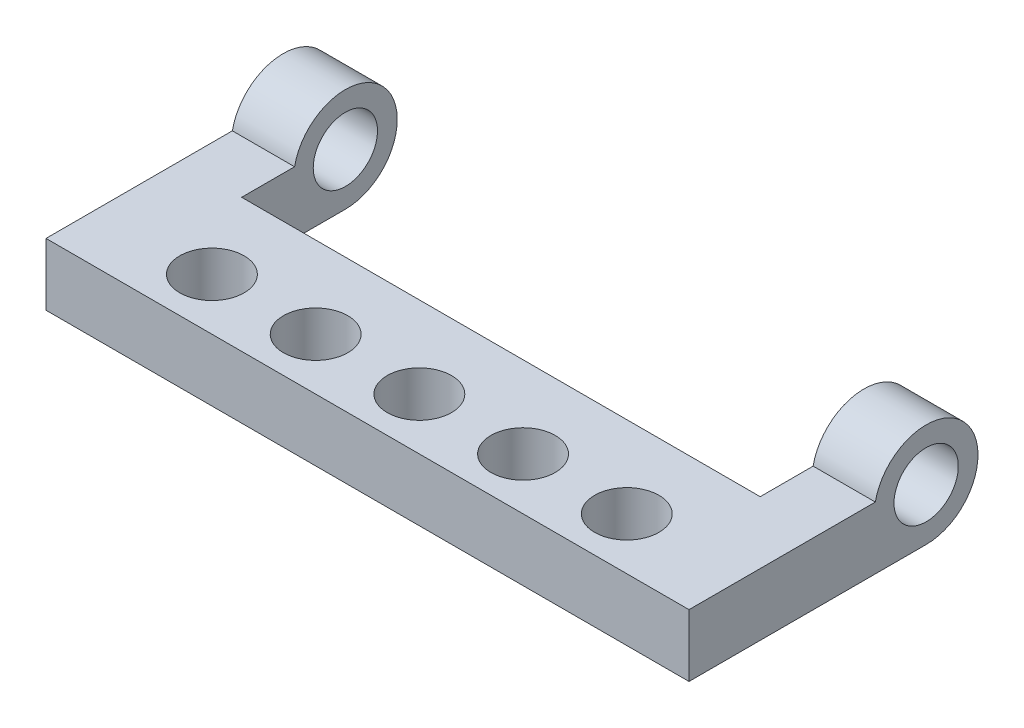
ISO-10303-21;
HEADER;
FILE_DESCRIPTION(('STEP AP214'),'2;1');
FILE_NAME('part.step','',(''),(''),'','','');
FILE_SCHEMA(('AUTOMOTIVE_DESIGN { 1 0 10303 214 1 1 1 1 }'));
ENDSEC;
DATA;
#1=APPLICATION_CONTEXT('core data for automotive mechanical design processes');
#2=APPLICATION_PROTOCOL_DEFINITION('international standard','automotive_design',2000,#1);
#3=PRODUCT_CONTEXT('',#1,'mechanical');
#4=PRODUCT('Part','Part','',(#3));
#5=PRODUCT_RELATED_PRODUCT_CATEGORY('part','',(#4));
#6=PRODUCT_DEFINITION_FORMATION('','',#4);
#7=PRODUCT_DEFINITION_CONTEXT('part definition',#1,'design');
#8=PRODUCT_DEFINITION('design','',#6,#7);
#9=PRODUCT_DEFINITION_SHAPE('','',#8);
#10=(LENGTH_UNIT() NAMED_UNIT(*) SI_UNIT(.MILLI.,.METRE.));
#11=(NAMED_UNIT(*) PLANE_ANGLE_UNIT() SI_UNIT($,.RADIAN.));
#12=(NAMED_UNIT(*) SI_UNIT($,.STERADIAN.) SOLID_ANGLE_UNIT());
#13=UNCERTAINTY_MEASURE_WITH_UNIT(LENGTH_MEASURE(1.E-05),#10,'distance_accuracy_value','');
#14=(GEOMETRIC_REPRESENTATION_CONTEXT(3) GLOBAL_UNCERTAINTY_ASSIGNED_CONTEXT((#13)) GLOBAL_UNIT_ASSIGNED_CONTEXT((#10,
#11,#12)) REPRESENTATION_CONTEXT('',''));
#15=CARTESIAN_POINT('',(0.,0.,0.));
#16=DIRECTION('',(0.,0.,1.));
#17=DIRECTION('',(1.,0.,0.));
#18=AXIS2_PLACEMENT_3D('',#15,#16,#17);
#19=CARTESIAN_POINT('',(19.8840620433566,2.5,-5.71642561983472));
#20=DIRECTION('',(-1.,0.,0.));
#21=DIRECTION('',(0.,0.,1.));
#22=AXIS2_PLACEMENT_3D('',#19,#20,#21);
#23=CYLINDRICAL_SURFACE('',#22,1.55);
#24=CARTESIAN_POINT('',(12.5,2.5,-5.71642561983472));
#25=DIRECTION('',(1.,0.,0.));
#26=DIRECTION('',(0.,0.,-1.));
#27=AXIS2_PLACEMENT_3D('',#24,#25,#26);
#28=CIRCLE('',#27,1.55);
#29=CARTESIAN_POINT('',(12.5,2.5,-7.26642561983472));
#30=VERTEX_POINT('',#29);
#31=EDGE_CURVE('E156',#30,#30,#28,.F.);
#32=ORIENTED_EDGE('',*,*,#31,.T.);
#33=EDGE_LOOP('',(#32));
#34=FACE_BOUND('',#33,.T.);
#35=CARTESIAN_POINT('',(15.5,2.5,-5.71642561983472));
#36=DIRECTION('',(-1.,0.,0.));
#37=DIRECTION('',(0.,0.,1.));
#38=AXIS2_PLACEMENT_3D('',#35,#36,#37);
#39=CIRCLE('',#38,1.55);
#40=CARTESIAN_POINT('',(15.5,2.5,-4.16642561983472));
#41=VERTEX_POINT('',#40);
#42=EDGE_CURVE('E172',#41,#41,#39,.F.);
#43=ORIENTED_EDGE('',*,*,#42,.T.);
#44=EDGE_LOOP('',(#43));
#45=FACE_BOUND('',#44,.T.);
#46=ADVANCED_FACE('F43',(#34,#45),#23,.F.);
#47=CARTESIAN_POINT('',(22.5710678118655,2.5,-5.71642561983472));
#48=DIRECTION('',(-1.,0.,0.));
#49=DIRECTION('',(0.,0.,1.));
#50=AXIS2_PLACEMENT_3D('',#47,#48,#49);
#51=CYLINDRICAL_SURFACE('',#50,2.5);
#52=CARTESIAN_POINT('',(-12.5,2.5,-5.71642561983472));
#53=DIRECTION('',(-1.,0.,0.));
#54=DIRECTION('',(0.,0.,1.));
#55=AXIS2_PLACEMENT_3D('',#52,#53,#54);
#56=CIRCLE('',#55,2.5);
#57=CARTESIAN_POINT('',(-12.5,0.,-5.71642561983472));
#58=VERTEX_POINT('',#57);
#59=CARTESIAN_POINT('',(-12.5,3.,-3.26693587705154));
#60=VERTEX_POINT('',#59);
#61=EDGE_CURVE('E52',#58,#60,#56,.F.);
#62=ORIENTED_EDGE('',*,*,#61,.F.);
#63=DIRECTION('',(-1.,0.,0.));
#64=VECTOR('',#63,1.);
#65=CARTESIAN_POINT('',(-15.5,0.,-5.71642561983472));
#66=LINE('',#65,#64);
#67=CARTESIAN_POINT('',(-15.5,0.,-5.71642561983472));
#68=VERTEX_POINT('',#67);
#69=EDGE_CURVE('E230',#58,#68,#66,.T.);
#70=ORIENTED_EDGE('',*,*,#69,.T.);
#71=CARTESIAN_POINT('',(-15.5,2.5,-5.71642561983472));
#72=DIRECTION('',(-1.,0.,0.));
#73=DIRECTION('',(0.,0.,1.));
#74=AXIS2_PLACEMENT_3D('',#71,#72,#73);
#75=CIRCLE('',#74,2.5);
#76=CARTESIAN_POINT('',(-15.5,3.,-3.26693587705154));
#77=VERTEX_POINT('',#76);
#78=EDGE_CURVE('E162',#77,#68,#75,.T.);
#79=ORIENTED_EDGE('',*,*,#78,.F.);
#80=DIRECTION('',(-1.,0.,0.));
#81=VECTOR('',#80,1.);
#82=CARTESIAN_POINT('',(22.5710678118655,3.,-3.26693587705154));
#83=LINE('',#82,#81);
#84=EDGE_CURVE('E67',#77,#60,#83,.F.);
#85=ORIENTED_EDGE('',*,*,#84,.T.);
#86=EDGE_LOOP('',(#62,#70,#79,#85));
#87=FACE_BOUND('',#86,.T.);
#88=ADVANCED_FACE('F257',(#87),#51,.T.);
#89=CARTESIAN_POINT('',(0.,3.,0.));
#90=DIRECTION('',(0.,1.,0.));
#91=DIRECTION('',(0.,0.,1.));
#92=AXIS2_PLACEMENT_3D('',#89,#90,#91);
#93=PLANE('',#92);
#94=DIRECTION('',(0.,0.,-1.));
#95=VECTOR('',#94,1.);
#96=CARTESIAN_POINT('',(12.5,3.,0.));
#97=LINE('',#96,#95);
#98=CARTESIAN_POINT('',(12.5,3.,-0.716425619834722));
#99=VERTEX_POINT('',#98);
#100=CARTESIAN_POINT('',(12.5,3.,-3.26693587705154));
#101=VERTEX_POINT('',#100);
#102=EDGE_CURVE('E153',#99,#101,#97,.T.);
#103=ORIENTED_EDGE('',*,*,#102,.F.);
#104=DIRECTION('',(1.,0.,0.));
#105=VECTOR('',#104,1.);
#106=CARTESIAN_POINT('',(0.,3.,-0.716425619834722));
#107=LINE('',#106,#105);
#108=CARTESIAN_POINT('',(-12.5,3.,-0.716425619834722));
#109=VERTEX_POINT('',#108);
#110=EDGE_CURVE('E118',#109,#99,#107,.T.);
#111=ORIENTED_EDGE('',*,*,#110,.F.);
#112=DIRECTION('',(0.,0.,1.));
#113=VECTOR('',#112,1.);
#114=CARTESIAN_POINT('',(-12.5,3.,0.));
#115=LINE('',#114,#113);
#116=EDGE_CURVE('E145',#60,#109,#115,.T.);
#117=ORIENTED_EDGE('',*,*,#116,.F.);
#118=ORIENTED_EDGE('',*,*,#84,.F.);
#119=DIRECTION('',(0.,0.,1.));
#120=VECTOR('',#119,1.);
#121=CARTESIAN_POINT('',(-15.5,3.,-5.71642561983472));
#122=LINE('',#121,#120);
#123=CARTESIAN_POINT('',(-15.5,3.,5.71642561983472));
#124=VERTEX_POINT('',#123);
#125=EDGE_CURVE('E220',#77,#124,#122,.T.);
#126=ORIENTED_EDGE('',*,*,#125,.T.);
#127=DIRECTION('',(1.,0.,0.));
#128=VECTOR('',#127,1.);
#129=CARTESIAN_POINT('',(-15.5,3.,5.71642561983472));
#130=LINE('',#129,#128);
#131=CARTESIAN_POINT('',(15.5,3.,5.71642561983472));
#132=VERTEX_POINT('',#131);
#133=EDGE_CURVE('E224',#124,#132,#130,.T.);
#134=ORIENTED_EDGE('',*,*,#133,.T.);
#135=DIRECTION('',(0.,0.,-1.));
#136=VECTOR('',#135,1.);
#137=CARTESIAN_POINT('',(15.5,3.,-5.71642561983472));
#138=LINE('',#137,#136);
#139=CARTESIAN_POINT('',(15.5,3.,-3.26693587705154));
#140=VERTEX_POINT('',#139);
#141=EDGE_CURVE('E217',#132,#140,#138,.T.);
#142=ORIENTED_EDGE('',*,*,#141,.T.);
#143=EDGE_CURVE('E59',#101,#140,#83,.F.);
#144=ORIENTED_EDGE('',*,*,#143,.F.);
#145=EDGE_LOOP('',(#103,#111,#117,#118,#126,#134,#142,#144));
#146=FACE_BOUND('',#145,.T.);
#147=CARTESIAN_POINT('',(-5.,3.,3.21642561983476));
#148=DIRECTION('',(0.,1.,0.));
#149=DIRECTION('',(0.,0.,1.));
#150=AXIS2_PLACEMENT_3D('',#147,#148,#149);
#151=CIRCLE('',#150,1.55);
#152=CARTESIAN_POINT('',(-5.,3.,4.76642561983476));
#153=VERTEX_POINT('',#152);
#154=EDGE_CURVE('E185',#153,#153,#151,.T.);
#155=ORIENTED_EDGE('',*,*,#154,.F.);
#156=EDGE_LOOP('',(#155));
#157=FACE_BOUND('',#156,.T.);
#158=CARTESIAN_POINT('',(5.,3.,3.21642561983472));
#159=DIRECTION('',(0.,1.,0.));
#160=DIRECTION('',(0.,0.,1.));
#161=AXIS2_PLACEMENT_3D('',#158,#159,#160);
#162=CIRCLE('',#161,1.55);
#163=CARTESIAN_POINT('',(5.,3.,4.76642561983472));
#164=VERTEX_POINT('',#163);
#165=EDGE_CURVE('E201',#164,#164,#162,.T.);
#166=ORIENTED_EDGE('',*,*,#165,.F.);
#167=EDGE_LOOP('',(#166));
#168=FACE_BOUND('',#167,.T.);
#169=CARTESIAN_POINT('',(0.,3.,3.21642561983472));
#170=DIRECTION('',(0.,1.,0.));
#171=DIRECTION('',(0.,0.,1.));
#172=AXIS2_PLACEMENT_3D('',#169,#170,#171);
#173=CIRCLE('',#172,1.55);
#174=CARTESIAN_POINT('',(0.,3.,4.76642561983472));
#175=VERTEX_POINT('',#174);
#176=EDGE_CURVE('E209',#175,#175,#173,.T.);
#177=ORIENTED_EDGE('',*,*,#176,.F.);
#178=EDGE_LOOP('',(#177));
#179=FACE_BOUND('',#178,.T.);
#180=CARTESIAN_POINT('',(10.,3.,3.21642561983472));
#181=DIRECTION('',(0.,1.,0.));
#182=DIRECTION('',(0.,0.,1.));
#183=AXIS2_PLACEMENT_3D('',#180,#181,#182);
#184=CIRCLE('',#183,1.55);
#185=CARTESIAN_POINT('',(10.,3.,4.76642561983472));
#186=VERTEX_POINT('',#185);
#187=EDGE_CURVE('E193',#186,#186,#184,.T.);
#188=ORIENTED_EDGE('',*,*,#187,.F.);
#189=EDGE_LOOP('',(#188));
#190=FACE_BOUND('',#189,.T.);
#191=CARTESIAN_POINT('',(-10.,3.,3.21642561983479));
#192=DIRECTION('',(0.,1.,0.));
#193=DIRECTION('',(0.,0.,1.));
#194=AXIS2_PLACEMENT_3D('',#191,#192,#193);
#195=CIRCLE('',#194,1.55);
#196=CARTESIAN_POINT('',(-10.,3.,4.76642561983479));
#197=VERTEX_POINT('',#196);
#198=EDGE_CURVE('E177',#197,#197,#195,.T.);
#199=ORIENTED_EDGE('',*,*,#198,.F.);
#200=EDGE_LOOP('',(#199));
#201=FACE_BOUND('',#200,.T.);
#202=ADVANCED_FACE('F254',(#146,#157,#168,#179,#190,#201),#93,.T.);
#203=CARTESIAN_POINT('',(0.,0.,0.));
#204=DIRECTION('',(0.,1.,0.));
#205=DIRECTION('',(0.,0.,1.));
#206=AXIS2_PLACEMENT_3D('',#203,#204,#205);
#207=PLANE('',#206);
#208=DIRECTION('',(-1.,0.,0.));
#209=VECTOR('',#208,1.);
#210=CARTESIAN_POINT('',(-12.5,0.,-0.716425619834722));
#211=LINE('',#210,#209);
#212=CARTESIAN_POINT('',(12.5,0.,-0.716425619834722));
#213=VERTEX_POINT('',#212);
#214=CARTESIAN_POINT('',(-12.5,0.,-0.716425619834722));
#215=VERTEX_POINT('',#214);
#216=EDGE_CURVE('E115',#213,#215,#211,.T.);
#217=ORIENTED_EDGE('',*,*,#216,.F.);
#218=DIRECTION('',(0.,0.,1.));
#219=VECTOR('',#218,1.);
#220=CARTESIAN_POINT('',(12.5,0.,-0.716425619834722));
#221=LINE('',#220,#219);
#222=CARTESIAN_POINT('',(12.5,0.,-5.71642561983472));
#223=VERTEX_POINT('',#222);
#224=EDGE_CURVE('E127',#223,#213,#221,.T.);
#225=ORIENTED_EDGE('',*,*,#224,.F.);
#226=CARTESIAN_POINT('',(15.5,0.,-5.71642561983472));
#227=VERTEX_POINT('',#226);
#228=EDGE_CURVE('E231',#227,#223,#66,.T.);
#229=ORIENTED_EDGE('',*,*,#228,.F.);
#230=DIRECTION('',(0.,0.,-1.));
#231=VECTOR('',#230,1.);
#232=CARTESIAN_POINT('',(15.5,0.,-5.71642561983472));
#233=LINE('',#232,#231);
#234=CARTESIAN_POINT('',(15.5,0.,5.71642561983472));
#235=VERTEX_POINT('',#234);
#236=EDGE_CURVE('E213',#235,#227,#233,.T.);
#237=ORIENTED_EDGE('',*,*,#236,.F.);
#238=DIRECTION('',(1.,0.,0.));
#239=VECTOR('',#238,1.);
#240=CARTESIAN_POINT('',(-15.5,0.,5.71642561983472));
#241=LINE('',#240,#239);
#242=CARTESIAN_POINT('',(-15.5,0.,5.71642561983472));
#243=VERTEX_POINT('',#242);
#244=EDGE_CURVE('E221',#243,#235,#241,.T.);
#245=ORIENTED_EDGE('',*,*,#244,.F.);
#246=DIRECTION('',(0.,0.,1.));
#247=VECTOR('',#246,1.);
#248=CARTESIAN_POINT('',(-15.5,0.,-5.71642561983472));
#249=LINE('',#248,#247);
#250=EDGE_CURVE('E234',#68,#243,#249,.T.);
#251=ORIENTED_EDGE('',*,*,#250,.F.);
#252=ORIENTED_EDGE('',*,*,#69,.F.);
#253=DIRECTION('',(0.,0.,-1.));
#254=VECTOR('',#253,1.);
#255=CARTESIAN_POINT('',(-12.5,0.,-0.716425619834722));
#256=LINE('',#255,#254);
#257=EDGE_CURVE('E124',#215,#58,#256,.T.);
#258=ORIENTED_EDGE('',*,*,#257,.F.);
#259=EDGE_LOOP('',(#217,#225,#229,#237,#245,#251,#252,#258));
#260=FACE_BOUND('',#259,.T.);
#261=CARTESIAN_POINT('',(0.,0.,3.21642561983472));
#262=DIRECTION('',(0.,1.,0.));
#263=DIRECTION('',(0.,0.,1.));
#264=AXIS2_PLACEMENT_3D('',#261,#262,#263);
#265=CIRCLE('',#264,1.55);
#266=CARTESIAN_POINT('',(0.,0.,4.76642561983472));
#267=VERTEX_POINT('',#266);
#268=EDGE_CURVE('E205',#267,#267,#265,.T.);
#269=ORIENTED_EDGE('',*,*,#268,.T.);
#270=EDGE_LOOP('',(#269));
#271=FACE_BOUND('',#270,.T.);
#272=CARTESIAN_POINT('',(5.,0.,3.21642561983472));
#273=DIRECTION('',(0.,1.,0.));
#274=DIRECTION('',(0.,0.,1.));
#275=AXIS2_PLACEMENT_3D('',#272,#273,#274);
#276=CIRCLE('',#275,1.55);
#277=CARTESIAN_POINT('',(5.,0.,4.76642561983472));
#278=VERTEX_POINT('',#277);
#279=EDGE_CURVE('E197',#278,#278,#276,.T.);
#280=ORIENTED_EDGE('',*,*,#279,.T.);
#281=EDGE_LOOP('',(#280));
#282=FACE_BOUND('',#281,.T.);
#283=CARTESIAN_POINT('',(10.,0.,3.21642561983472));
#284=DIRECTION('',(0.,1.,0.));
#285=DIRECTION('',(0.,0.,1.));
#286=AXIS2_PLACEMENT_3D('',#283,#284,#285);
#287=CIRCLE('',#286,1.55);
#288=CARTESIAN_POINT('',(10.,0.,4.76642561983472));
#289=VERTEX_POINT('',#288);
#290=EDGE_CURVE('E189',#289,#289,#287,.T.);
#291=ORIENTED_EDGE('',*,*,#290,.T.);
#292=EDGE_LOOP('',(#291));
#293=FACE_BOUND('',#292,.T.);
#294=CARTESIAN_POINT('',(-5.,0.,3.21642561983476));
#295=DIRECTION('',(0.,1.,0.));
#296=DIRECTION('',(0.,0.,1.));
#297=AXIS2_PLACEMENT_3D('',#294,#295,#296);
#298=CIRCLE('',#297,1.55);
#299=CARTESIAN_POINT('',(-5.,0.,4.76642561983476));
#300=VERTEX_POINT('',#299);
#301=EDGE_CURVE('E181',#300,#300,#298,.T.);
#302=ORIENTED_EDGE('',*,*,#301,.T.);
#303=EDGE_LOOP('',(#302));
#304=FACE_BOUND('',#303,.T.);
#305=CARTESIAN_POINT('',(-10.,0.,3.21642561983479));
#306=DIRECTION('',(0.,1.,0.));
#307=DIRECTION('',(0.,0.,1.));
#308=AXIS2_PLACEMENT_3D('',#305,#306,#307);
#309=CIRCLE('',#308,1.55);
#310=CARTESIAN_POINT('',(-10.,0.,4.76642561983479));
#311=VERTEX_POINT('',#310);
#312=EDGE_CURVE('E176',#311,#311,#309,.T.);
#313=ORIENTED_EDGE('',*,*,#312,.T.);
#314=EDGE_LOOP('',(#313));
#315=FACE_BOUND('',#314,.T.);
#316=ADVANCED_FACE('F135',(#260,#271,#282,#293,#304,#315),#207,.F.);
#317=CARTESIAN_POINT('',(15.5,3.,-5.71642561983472));
#318=DIRECTION('',(-1.,0.,0.));
#319=DIRECTION('',(0.,0.,1.));
#320=AXIS2_PLACEMENT_3D('',#317,#318,#319);
#321=PLANE('',#320);
#322=CARTESIAN_POINT('',(15.5,2.5,-5.71642561983472));
#323=DIRECTION('',(-1.,0.,0.));
#324=DIRECTION('',(0.,0.,1.));
#325=AXIS2_PLACEMENT_3D('',#322,#323,#324);
#326=CIRCLE('',#325,2.5);
#327=EDGE_CURVE('E163',#227,#140,#326,.F.);
#328=ORIENTED_EDGE('',*,*,#327,.T.);
#329=ORIENTED_EDGE('',*,*,#141,.F.);
#330=DIRECTION('',(0.,-1.,0.));
#331=VECTOR('',#330,1.);
#332=CARTESIAN_POINT('',(15.5,3.,5.71642561983472));
#333=LINE('',#332,#331);
#334=EDGE_CURVE('E227',#132,#235,#333,.T.);
#335=ORIENTED_EDGE('',*,*,#334,.T.);
#336=ORIENTED_EDGE('',*,*,#236,.T.);
#337=EDGE_LOOP('',(#328,#329,#335,#336));
#338=FACE_BOUND('',#337,.T.);
#339=ORIENTED_EDGE('',*,*,#42,.F.);
#340=EDGE_LOOP('',(#339));
#341=FACE_BOUND('',#340,.T.);
#342=ADVANCED_FACE('F45',(#338,#341),#321,.F.);
#343=CARTESIAN_POINT('',(-15.5,3.,-5.71642561983472));
#344=DIRECTION('',(1.,0.,0.));
#345=DIRECTION('',(0.,0.,-1.));
#346=AXIS2_PLACEMENT_3D('',#343,#344,#345);
#347=PLANE('',#346);
#348=ORIENTED_EDGE('',*,*,#125,.F.);
#349=ORIENTED_EDGE('',*,*,#78,.T.);
#350=ORIENTED_EDGE('',*,*,#250,.T.);
#351=DIRECTION('',(0.,-1.,0.));
#352=VECTOR('',#351,1.);
#353=CARTESIAN_POINT('',(-15.5,3.,5.71642561983472));
#354=LINE('',#353,#352);
#355=EDGE_CURVE('E242',#124,#243,#354,.T.);
#356=ORIENTED_EDGE('',*,*,#355,.F.);
#357=EDGE_LOOP('',(#348,#349,#350,#356));
#358=FACE_BOUND('',#357,.T.);
#359=CARTESIAN_POINT('',(-15.5,2.5,-5.71642561983472));
#360=DIRECTION('',(1.,0.,0.));
#361=DIRECTION('',(0.,0.,-1.));
#362=AXIS2_PLACEMENT_3D('',#359,#360,#361);
#363=CIRCLE('',#362,1.55);
#364=CARTESIAN_POINT('',(-15.5,2.5,-7.26642561983472));
#365=VERTEX_POINT('',#364);
#366=EDGE_CURVE('E246',#365,#365,#363,.T.);
#367=ORIENTED_EDGE('',*,*,#366,.T.);
#368=EDGE_LOOP('',(#367));
#369=FACE_BOUND('',#368,.T.);
#370=ADVANCED_FACE('F260',(#358,#369),#347,.F.);
#371=CARTESIAN_POINT('',(-15.5,3.,5.71642561983472));
#372=DIRECTION('',(0.,0.,-1.));
#373=DIRECTION('',(-1.,0.,0.));
#374=AXIS2_PLACEMENT_3D('',#371,#372,#373);
#375=PLANE('',#374);
#376=ORIENTED_EDGE('',*,*,#244,.T.);
#377=ORIENTED_EDGE('',*,*,#334,.F.);
#378=ORIENTED_EDGE('',*,*,#133,.F.);
#379=ORIENTED_EDGE('',*,*,#355,.T.);
#380=EDGE_LOOP('',(#376,#377,#378,#379));
#381=FACE_BOUND('',#380,.T.);
#382=ADVANCED_FACE('F267',(#381),#375,.F.);
#383=CARTESIAN_POINT('',(0.,3.,3.21642561983472));
#384=DIRECTION('',(0.,-1.,0.));
#385=DIRECTION('',(0.,0.,-1.));
#386=AXIS2_PLACEMENT_3D('',#383,#384,#385);
#387=CYLINDRICAL_SURFACE('',#386,1.55);
#388=ORIENTED_EDGE('',*,*,#176,.T.);
#389=EDGE_LOOP('',(#388));
#390=FACE_BOUND('',#389,.T.);
#391=ORIENTED_EDGE('',*,*,#268,.F.);
#392=EDGE_LOOP('',(#391));
#393=FACE_BOUND('',#392,.T.);
#394=ADVANCED_FACE('F307',(#390,#393),#387,.F.);
#395=CARTESIAN_POINT('',(5.,3.,3.21642561983472));
#396=DIRECTION('',(0.,-1.,0.));
#397=DIRECTION('',(0.,0.,-1.));
#398=AXIS2_PLACEMENT_3D('',#395,#396,#397);
#399=CYLINDRICAL_SURFACE('',#398,1.55);
#400=ORIENTED_EDGE('',*,*,#165,.T.);
#401=EDGE_LOOP('',(#400));
#402=FACE_BOUND('',#401,.T.);
#403=ORIENTED_EDGE('',*,*,#279,.F.);
#404=EDGE_LOOP('',(#403));
#405=FACE_BOUND('',#404,.T.);
#406=ADVANCED_FACE('F303',(#402,#405),#399,.F.);
#407=CARTESIAN_POINT('',(10.,3.,3.21642561983472));
#408=DIRECTION('',(0.,-1.,0.));
#409=DIRECTION('',(0.,0.,-1.));
#410=AXIS2_PLACEMENT_3D('',#407,#408,#409);
#411=CYLINDRICAL_SURFACE('',#410,1.55);
#412=ORIENTED_EDGE('',*,*,#187,.T.);
#413=EDGE_LOOP('',(#412));
#414=FACE_BOUND('',#413,.T.);
#415=ORIENTED_EDGE('',*,*,#290,.F.);
#416=EDGE_LOOP('',(#415));
#417=FACE_BOUND('',#416,.T.);
#418=ADVANCED_FACE('F299',(#414,#417),#411,.F.);
#419=CARTESIAN_POINT('',(-5.,3.,3.21642561983476));
#420=DIRECTION('',(0.,-1.,0.));
#421=DIRECTION('',(0.,0.,-1.));
#422=AXIS2_PLACEMENT_3D('',#419,#420,#421);
#423=CYLINDRICAL_SURFACE('',#422,1.55);
#424=ORIENTED_EDGE('',*,*,#154,.T.);
#425=EDGE_LOOP('',(#424));
#426=FACE_BOUND('',#425,.T.);
#427=ORIENTED_EDGE('',*,*,#301,.F.);
#428=EDGE_LOOP('',(#427));
#429=FACE_BOUND('',#428,.T.);
#430=ADVANCED_FACE('F295',(#426,#429),#423,.F.);
#431=CARTESIAN_POINT('',(-10.,3.,3.21642561983479));
#432=DIRECTION('',(0.,-1.,0.));
#433=DIRECTION('',(0.,0.,-1.));
#434=AXIS2_PLACEMENT_3D('',#431,#432,#433);
#435=CYLINDRICAL_SURFACE('',#434,1.55);
#436=ORIENTED_EDGE('',*,*,#198,.T.);
#437=EDGE_LOOP('',(#436));
#438=FACE_BOUND('',#437,.T.);
#439=ORIENTED_EDGE('',*,*,#312,.F.);
#440=EDGE_LOOP('',(#439));
#441=FACE_BOUND('',#440,.T.);
#442=ADVANCED_FACE('F283',(#438,#441),#435,.F.);
#443=CARTESIAN_POINT('',(-12.5,2.5,-5.71642561983472));
#444=DIRECTION('',(-1.,0.,0.));
#445=DIRECTION('',(0.,0.,1.));
#446=AXIS2_PLACEMENT_3D('',#443,#444,#445);
#447=CIRCLE('',#446,1.55);
#448=CARTESIAN_POINT('',(-12.5,2.5,-4.16642561983472));
#449=VERTEX_POINT('',#448);
#450=EDGE_CURVE('E149',#449,#449,#447,.F.);
#451=ORIENTED_EDGE('',*,*,#450,.T.);
#452=EDGE_LOOP('',(#451));
#453=FACE_BOUND('',#452,.T.);
#454=ORIENTED_EDGE('',*,*,#366,.F.);
#455=EDGE_LOOP('',(#454));
#456=FACE_BOUND('',#455,.T.);
#457=ADVANCED_FACE('F276',(#453,#456),#23,.F.);
#458=CARTESIAN_POINT('',(12.5,2.5,-5.71642561983472));
#459=DIRECTION('',(1.,0.,0.));
#460=DIRECTION('',(0.,0.,-1.));
#461=AXIS2_PLACEMENT_3D('',#458,#459,#460);
#462=CIRCLE('',#461,2.5);
#463=EDGE_CURVE('E11',#101,#223,#462,.F.);
#464=ORIENTED_EDGE('',*,*,#463,.F.);
#465=ORIENTED_EDGE('',*,*,#143,.T.);
#466=ORIENTED_EDGE('',*,*,#327,.F.);
#467=ORIENTED_EDGE('',*,*,#228,.T.);
#468=EDGE_LOOP('',(#464,#465,#466,#467));
#469=FACE_BOUND('',#468,.T.);
#470=ADVANCED_FACE('F272',(#469),#51,.T.);
#471=CARTESIAN_POINT('',(12.5,5.,-0.716425619834722));
#472=DIRECTION('',(1.,0.,0.));
#473=DIRECTION('',(0.,0.,-1.));
#474=AXIS2_PLACEMENT_3D('',#471,#472,#473);
#475=PLANE('',#474);
#476=ORIENTED_EDGE('',*,*,#102,.T.);
#477=ORIENTED_EDGE('',*,*,#463,.T.);
#478=ORIENTED_EDGE('',*,*,#224,.T.);
#479=DIRECTION('',(0.,-1.,0.));
#480=VECTOR('',#479,1.);
#481=CARTESIAN_POINT('',(12.5,5.,-0.716425619834722));
#482=LINE('',#481,#480);
#483=EDGE_CURVE('E110',#99,#213,#482,.T.);
#484=ORIENTED_EDGE('',*,*,#483,.F.);
#485=EDGE_LOOP('',(#476,#477,#478,#484));
#486=FACE_BOUND('',#485,.T.);
#487=ORIENTED_EDGE('',*,*,#31,.F.);
#488=EDGE_LOOP('',(#487));
#489=FACE_BOUND('',#488,.T.);
#490=ADVANCED_FACE('F128',(#486,#489),#475,.F.);
#491=CARTESIAN_POINT('',(-12.5,5.,-0.716425619834722));
#492=DIRECTION('',(-1.,0.,0.));
#493=DIRECTION('',(0.,0.,1.));
#494=AXIS2_PLACEMENT_3D('',#491,#492,#493);
#495=PLANE('',#494);
#496=ORIENTED_EDGE('',*,*,#116,.T.);
#497=DIRECTION('',(0.,-1.,0.));
#498=VECTOR('',#497,1.);
#499=CARTESIAN_POINT('',(-12.5,5.,-0.716425619834722));
#500=LINE('',#499,#498);
#501=EDGE_CURVE('E123',#109,#215,#500,.T.);
#502=ORIENTED_EDGE('',*,*,#501,.T.);
#503=ORIENTED_EDGE('',*,*,#257,.T.);
#504=ORIENTED_EDGE('',*,*,#61,.T.);
#505=EDGE_LOOP('',(#496,#502,#503,#504));
#506=FACE_BOUND('',#505,.T.);
#507=ORIENTED_EDGE('',*,*,#450,.F.);
#508=EDGE_LOOP('',(#507));
#509=FACE_BOUND('',#508,.T.);
#510=ADVANCED_FACE('F251',(#506,#509),#495,.F.);
#511=CARTESIAN_POINT('',(-12.5,5.,-0.716425619834722));
#512=DIRECTION('',(0.,0.,1.));
#513=DIRECTION('',(1.,0.,0.));
#514=AXIS2_PLACEMENT_3D('',#511,#512,#513);
#515=PLANE('',#514);
#516=ORIENTED_EDGE('',*,*,#110,.T.);
#517=ORIENTED_EDGE('',*,*,#483,.T.);
#518=ORIENTED_EDGE('',*,*,#216,.T.);
#519=ORIENTED_EDGE('',*,*,#501,.F.);
#520=EDGE_LOOP('',(#516,#517,#518,#519));
#521=FACE_BOUND('',#520,.T.);
#522=ADVANCED_FACE('F112',(#521),#515,.F.);
#523=CLOSED_SHELL('',(#46,#88,#202,#316,#342,#370,#382,#394,#406,#418,#430,#442,#457,#470,#490,
#510,#522));
#524=MANIFOLD_SOLID_BREP('B2',#523);
#525=ADVANCED_BREP_SHAPE_REPRESENTATION('',(#18,#524),#14);
#526=SHAPE_DEFINITION_REPRESENTATION(#9,#525);
ENDSEC;
END-ISO-10303-21;
